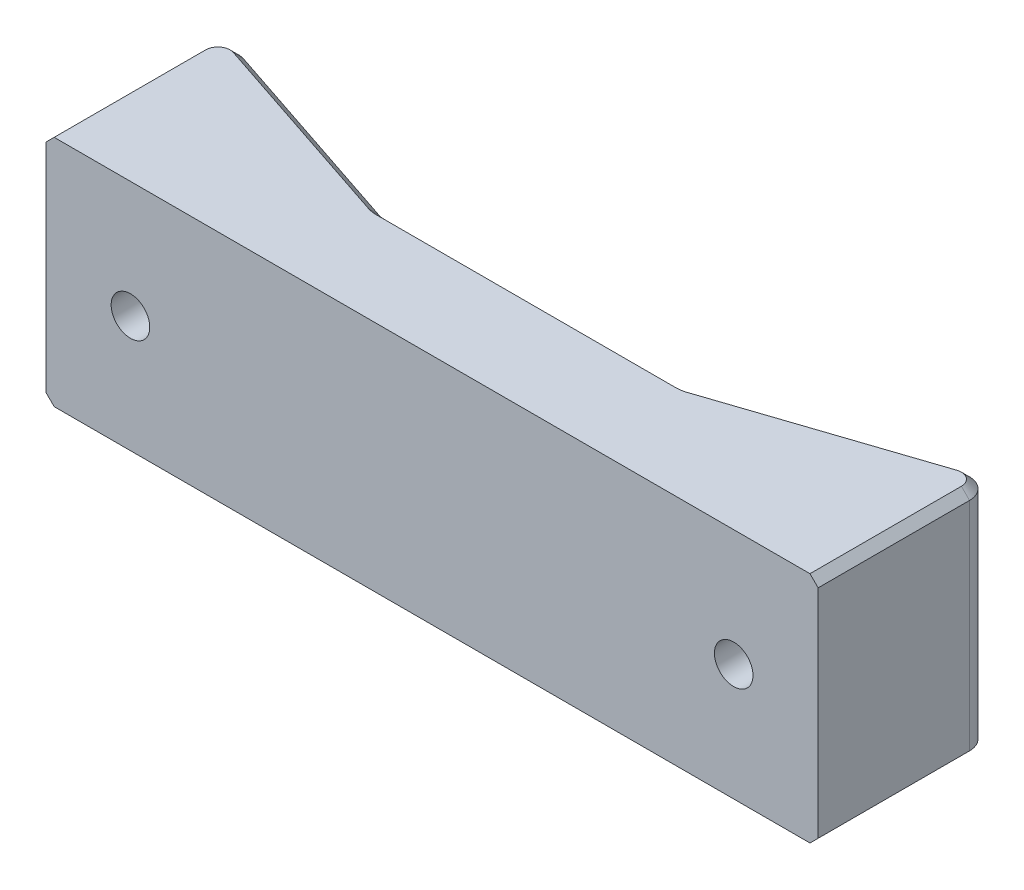
ISO-10303-21;
HEADER;
FILE_DESCRIPTION(('STEP AP214'),'2;1');
FILE_NAME('part.step','',(''),(''),'','','');
FILE_SCHEMA(('AUTOMOTIVE_DESIGN { 1 0 10303 214 1 1 1 1 }'));
ENDSEC;
DATA;
#1=APPLICATION_CONTEXT('core data for automotive mechanical design processes');
#2=APPLICATION_PROTOCOL_DEFINITION('international standard','automotive_design',2000,#1);
#3=PRODUCT_CONTEXT('',#1,'mechanical');
#4=PRODUCT('Part','Part','',(#3));
#5=PRODUCT_RELATED_PRODUCT_CATEGORY('part','',(#4));
#6=PRODUCT_DEFINITION_FORMATION('','',#4);
#7=PRODUCT_DEFINITION_CONTEXT('part definition',#1,'design');
#8=PRODUCT_DEFINITION('design','',#6,#7);
#9=PRODUCT_DEFINITION_SHAPE('','',#8);
#10=(LENGTH_UNIT() NAMED_UNIT(*) SI_UNIT(.MILLI.,.METRE.));
#11=(NAMED_UNIT(*) PLANE_ANGLE_UNIT() SI_UNIT($,.RADIAN.));
#12=(NAMED_UNIT(*) SI_UNIT($,.STERADIAN.) SOLID_ANGLE_UNIT());
#13=UNCERTAINTY_MEASURE_WITH_UNIT(LENGTH_MEASURE(1.E-05),#10,'distance_accuracy_value','');
#14=(GEOMETRIC_REPRESENTATION_CONTEXT(3) GLOBAL_UNCERTAINTY_ASSIGNED_CONTEXT((#13)) GLOBAL_UNIT_ASSIGNED_CONTEXT((#10,
#11,#12)) REPRESENTATION_CONTEXT('',''));
#15=CARTESIAN_POINT('',(0.,0.,0.));
#16=DIRECTION('',(0.,0.,1.));
#17=DIRECTION('',(1.,0.,0.));
#18=AXIS2_PLACEMENT_3D('',#15,#16,#17);
#19=CARTESIAN_POINT('',(48.,14.5,0.));
#20=DIRECTION('',(-1.,0.,0.));
#21=DIRECTION('',(0.,0.,1.));
#22=AXIS2_PLACEMENT_3D('',#19,#20,#21);
#23=PLANE('',#22);
#24=DIRECTION('',(0.,-1.,0.));
#25=VECTOR('',#24,1.);
#26=CARTESIAN_POINT('',(48.,14.5,0.));
#27=LINE('',#26,#25);
#28=CARTESIAN_POINT('',(48.,13.484,0.));
#29=VERTEX_POINT('',#28);
#30=CARTESIAN_POINT('',(48.,-13.484,0.));
#31=VERTEX_POINT('',#30);
#32=EDGE_CURVE('E205',#29,#31,#27,.T.);
#33=ORIENTED_EDGE('',*,*,#32,.T.);
#34=DIRECTION('',(0.,0.,-1.));
#35=VECTOR('',#34,1.);
#36=CARTESIAN_POINT('',(48.,-13.484,0.));
#37=LINE('',#36,#35);
#38=CARTESIAN_POINT('',(48.,-13.484,-18.8259382477241));
#39=VERTEX_POINT('',#38);
#40=EDGE_CURVE('E183',#31,#39,#37,.T.);
#41=ORIENTED_EDGE('',*,*,#40,.T.);
#42=DIRECTION('',(0.,-1.,0.));
#43=VECTOR('',#42,1.);
#44=CARTESIAN_POINT('',(48.,14.5,-18.8259382477241));
#45=LINE('',#44,#43);
#46=CARTESIAN_POINT('',(48.,13.484,-18.8259382477241));
#47=VERTEX_POINT('',#46);
#48=EDGE_CURVE('E203',#39,#47,#45,.F.);
#49=ORIENTED_EDGE('',*,*,#48,.T.);
#50=DIRECTION('',(0.,0.,1.));
#51=VECTOR('',#50,1.);
#52=CARTESIAN_POINT('',(48.,13.484,0.));
#53=LINE('',#52,#51);
#54=EDGE_CURVE('E207',#47,#29,#53,.T.);
#55=ORIENTED_EDGE('',*,*,#54,.T.);
#56=EDGE_LOOP('',(#33,#41,#49,#55));
#57=FACE_BOUND('',#56,.T.);
#58=ADVANCED_FACE('F35',(#57),#23,.F.);
#59=CARTESIAN_POINT('',(48.,14.5,-22.35));
#60=DIRECTION('',(0.316227766016838,0.,0.948683298050514));
#61=DIRECTION('',(0.948683298050514,0.,-0.316227766016838));
#62=AXIS2_PLACEMENT_3D('',#59,#60,#61);
#63=PLANE('',#62);
#64=CARTESIAN_POINT('',(37.5,0.,-18.85));
#65=DIRECTION('',(0.316227766016838,0.,0.948683298050514));
#66=DIRECTION('',(0.948683298050514,0.,-0.316227766016838));
#67=AXIS2_PLACEMENT_3D('',#64,#65,#66);
#68=ELLIPSE('',#67,4.95423500093046,4.7);
#69=CARTESIAN_POINT('',(42.2,0.,-20.4166666666667));
#70=VERTEX_POINT('',#69);
#71=EDGE_CURVE('E348',#70,#70,#68,.T.);
#72=ORIENTED_EDGE('',*,*,#71,.T.);
#73=EDGE_LOOP('',(#72));
#74=FACE_BOUND('',#73,.T.);
#75=DIRECTION('',(0.,-1.,0.));
#76=VECTOR('',#75,1.);
#77=CARTESIAN_POINT('',(44.6567814743172,14.5,-21.2355938247724));
#78=LINE('',#77,#76);
#79=CARTESIAN_POINT('',(44.6567814743172,13.484,-21.2355938247724));
#80=VERTEX_POINT('',#79);
#81=CARTESIAN_POINT('',(44.6567814743172,-13.484,-21.2355938247724));
#82=VERTEX_POINT('',#81);
#83=EDGE_CURVE('E215',#80,#82,#78,.T.);
#84=ORIENTED_EDGE('',*,*,#83,.T.);
#85=DIRECTION('',(-0.948683298050514,0.,0.316227766016838));
#86=VECTOR('',#85,1.);
#87=CARTESIAN_POINT('',(48.,-13.484,-22.35));
#88=LINE('',#87,#86);
#89=CARTESIAN_POINT('',(19.4410332688551,-13.484,-12.8303444229517));
#90=VERTEX_POINT('',#89);
#91=EDGE_CURVE('E253',#82,#90,#88,.T.);
#92=ORIENTED_EDGE('',*,*,#91,.T.);
#93=DIRECTION('',(0.,-1.,0.));
#94=VECTOR('',#93,1.);
#95=CARTESIAN_POINT('',(19.4410332688551,14.5,-12.8303444229517));
#96=LINE('',#95,#94);
#97=CARTESIAN_POINT('',(19.4410332688551,13.484,-12.8303444229517));
#98=VERTEX_POINT('',#97);
#99=EDGE_CURVE('E211',#90,#98,#96,.F.);
#100=ORIENTED_EDGE('',*,*,#99,.T.);
#101=DIRECTION('',(0.948683298050514,0.,-0.316227766016838));
#102=VECTOR('',#101,1.);
#103=CARTESIAN_POINT('',(44.6567814743172,13.484,-21.2355938247724));
#104=LINE('',#103,#102);
#105=EDGE_CURVE('E251',#98,#80,#104,.T.);
#106=ORIENTED_EDGE('',*,*,#105,.T.);
#107=EDGE_LOOP('',(#84,#92,#100,#106));
#108=FACE_BOUND('',#107,.T.);
#109=ADVANCED_FACE('F378',(#74,#108),#63,.F.);
#110=CARTESIAN_POINT('',(19.05,14.5,-12.7));
#111=DIRECTION('',(0.,0.,1.));
#112=DIRECTION('',(1.,0.,0.));
#113=AXIS2_PLACEMENT_3D('',#110,#111,#112);
#114=PLANE('',#113);
#115=DIRECTION('',(0.,-1.,0.));
#116=VECTOR('',#115,1.);
#117=CARTESIAN_POINT('',(18.6378147431723,-14.5,-12.7));
#118=LINE('',#117,#116);
#119=CARTESIAN_POINT('',(18.6378147431723,13.484,-12.7));
#120=VERTEX_POINT('',#119);
#121=CARTESIAN_POINT('',(18.6378147431723,-13.484,-12.7));
#122=VERTEX_POINT('',#121);
#123=EDGE_CURVE('E371',#120,#122,#118,.T.);
#124=ORIENTED_EDGE('',*,*,#123,.T.);
#125=DIRECTION('',(-1.,0.,0.));
#126=VECTOR('',#125,1.);
#127=CARTESIAN_POINT('',(19.05,-13.484,-12.7));
#128=LINE('',#127,#126);
#129=CARTESIAN_POINT('',(-18.6378147431723,-13.484,-12.7));
#130=VERTEX_POINT('',#129);
#131=EDGE_CURVE('E269',#122,#130,#128,.T.);
#132=ORIENTED_EDGE('',*,*,#131,.T.);
#133=DIRECTION('',(0.,-1.,0.));
#134=VECTOR('',#133,1.);
#135=CARTESIAN_POINT('',(-18.6378147431723,14.5,-12.7));
#136=LINE('',#135,#134);
#137=CARTESIAN_POINT('',(-18.6378147431723,13.484,-12.7));
#138=VERTEX_POINT('',#137);
#139=EDGE_CURVE('E374',#130,#138,#136,.F.);
#140=ORIENTED_EDGE('',*,*,#139,.T.);
#141=DIRECTION('',(1.,0.,0.));
#142=VECTOR('',#141,1.);
#143=CARTESIAN_POINT('',(18.6378147431723,13.484,-12.7));
#144=LINE('',#143,#142);
#145=EDGE_CURVE('E267',#138,#120,#144,.T.);
#146=ORIENTED_EDGE('',*,*,#145,.T.);
#147=EDGE_LOOP('',(#124,#132,#140,#146));
#148=FACE_BOUND('',#147,.T.);
#149=ADVANCED_FACE('F397',(#148),#114,.F.);
#150=CARTESIAN_POINT('',(-48.,14.5,-22.35));
#151=DIRECTION('',(-0.316227766016838,0.,0.948683298050514));
#152=DIRECTION('',(0.948683298050514,0.,0.316227766016838));
#153=AXIS2_PLACEMENT_3D('',#150,#151,#152);
#154=PLANE('',#153);
#155=CARTESIAN_POINT('',(-37.5,0.,-18.85));
#156=DIRECTION('',(-0.316227766016838,0.,0.948683298050514));
#157=DIRECTION('',(-0.948683298050514,0.,-0.316227766016838));
#158=AXIS2_PLACEMENT_3D('',#155,#156,#157);
#159=ELLIPSE('',#158,4.95423500093046,4.7);
#160=CARTESIAN_POINT('',(-42.2,0.,-20.4166666666667));
#161=VERTEX_POINT('',#160);
#162=EDGE_CURVE('E358',#161,#161,#159,.T.);
#163=ORIENTED_EDGE('',*,*,#162,.T.);
#164=EDGE_LOOP('',(#163));
#165=FACE_BOUND('',#164,.T.);
#166=DIRECTION('',(0.,-1.,0.));
#167=VECTOR('',#166,1.);
#168=CARTESIAN_POINT('',(-19.4410332688551,-14.5,-12.8303444229517));
#169=LINE('',#168,#167);
#170=CARTESIAN_POINT('',(-19.4410332688551,13.484,-12.8303444229517));
#171=VERTEX_POINT('',#170);
#172=CARTESIAN_POINT('',(-19.4410332688551,-13.484,-12.8303444229517));
#173=VERTEX_POINT('',#172);
#174=EDGE_CURVE('E365',#171,#173,#169,.T.);
#175=ORIENTED_EDGE('',*,*,#174,.T.);
#176=DIRECTION('',(-0.948683298050514,0.,-0.316227766016838));
#177=VECTOR('',#176,1.);
#178=CARTESIAN_POINT('',(-48.,-13.484,-22.35));
#179=LINE('',#178,#177);
#180=CARTESIAN_POINT('',(-44.6567814743172,-13.484,-21.2355938247724));
#181=VERTEX_POINT('',#180);
#182=EDGE_CURVE('E257',#173,#181,#179,.T.);
#183=ORIENTED_EDGE('',*,*,#182,.T.);
#184=DIRECTION('',(0.,-1.,0.));
#185=VECTOR('',#184,1.);
#186=CARTESIAN_POINT('',(-44.6567814743172,14.5,-21.2355938247724));
#187=LINE('',#186,#185);
#188=CARTESIAN_POINT('',(-44.6567814743172,13.484,-21.2355938247724));
#189=VERTEX_POINT('',#188);
#190=EDGE_CURVE('E368',#181,#189,#187,.F.);
#191=ORIENTED_EDGE('',*,*,#190,.T.);
#192=DIRECTION('',(0.948683298050514,0.,0.316227766016838));
#193=VECTOR('',#192,1.);
#194=CARTESIAN_POINT('',(-19.4410332688551,13.484,-12.8303444229517));
#195=LINE('',#194,#193);
#196=EDGE_CURVE('E255',#189,#171,#195,.T.);
#197=ORIENTED_EDGE('',*,*,#196,.T.);
#198=EDGE_LOOP('',(#175,#183,#191,#197));
#199=FACE_BOUND('',#198,.T.);
#200=ADVANCED_FACE('F415',(#165,#199),#154,.F.);
#201=CARTESIAN_POINT('',(-48.,14.5,0.));
#202=DIRECTION('',(1.,0.,0.));
#203=DIRECTION('',(0.,0.,-1.));
#204=AXIS2_PLACEMENT_3D('',#201,#202,#203);
#205=PLANE('',#204);
#206=DIRECTION('',(0.,-1.,0.));
#207=VECTOR('',#206,1.);
#208=CARTESIAN_POINT('',(-48.,14.5,-18.8259382477241));
#209=LINE('',#208,#207);
#210=CARTESIAN_POINT('',(-48.,13.484,-18.8259382477241));
#211=VERTEX_POINT('',#210);
#212=CARTESIAN_POINT('',(-48.,-13.484,-18.8259382477241));
#213=VERTEX_POINT('',#212);
#214=EDGE_CURVE('E355',#211,#213,#209,.T.);
#215=ORIENTED_EDGE('',*,*,#214,.T.);
#216=DIRECTION('',(0.,0.,1.));
#217=VECTOR('',#216,1.);
#218=CARTESIAN_POINT('',(-48.,-13.484,0.));
#219=LINE('',#218,#217);
#220=CARTESIAN_POINT('',(-48.,-13.484,0.));
#221=VERTEX_POINT('',#220);
#222=EDGE_CURVE('E245',#213,#221,#219,.T.);
#223=ORIENTED_EDGE('',*,*,#222,.T.);
#224=DIRECTION('',(0.,-1.,0.));
#225=VECTOR('',#224,1.);
#226=CARTESIAN_POINT('',(-48.,14.5,0.));
#227=LINE('',#226,#225);
#228=CARTESIAN_POINT('',(-48.,13.484,0.));
#229=VERTEX_POINT('',#228);
#230=EDGE_CURVE('E346',#229,#221,#227,.T.);
#231=ORIENTED_EDGE('',*,*,#230,.F.);
#232=DIRECTION('',(0.,0.,-1.));
#233=VECTOR('',#232,1.);
#234=CARTESIAN_POINT('',(-48.,13.484,-18.8259382477241));
#235=LINE('',#234,#233);
#236=EDGE_CURVE('E243',#229,#211,#235,.T.);
#237=ORIENTED_EDGE('',*,*,#236,.T.);
#238=EDGE_LOOP('',(#215,#223,#231,#237));
#239=FACE_BOUND('',#238,.T.);
#240=ADVANCED_FACE('F431',(#239),#205,.F.);
#241=CARTESIAN_POINT('',(-48.,14.5,0.));
#242=DIRECTION('',(0.,0.,-1.));
#243=DIRECTION('',(-1.,0.,0.));
#244=AXIS2_PLACEMENT_3D('',#241,#242,#243);
#245=PLANE('',#244);
#246=CARTESIAN_POINT('',(-37.5,0.,0.));
#247=DIRECTION('',(0.,0.,-1.));
#248=DIRECTION('',(-1.,0.,0.));
#249=AXIS2_PLACEMENT_3D('',#246,#247,#248);
#250=CIRCLE('',#249,2.40000000000001);
#251=CARTESIAN_POINT('',(-39.9,0.,0.));
#252=VERTEX_POINT('',#251);
#253=EDGE_CURVE('E362',#252,#252,#250,.T.);
#254=ORIENTED_EDGE('',*,*,#253,.T.);
#255=EDGE_LOOP('',(#254));
#256=FACE_BOUND('',#255,.T.);
#257=CARTESIAN_POINT('',(37.5,0.,0.));
#258=DIRECTION('',(0.,0.,-1.));
#259=DIRECTION('',(-1.,0.,0.));
#260=AXIS2_PLACEMENT_3D('',#257,#258,#259);
#261=CIRCLE('',#260,2.40000000000001);
#262=CARTESIAN_POINT('',(35.1,0.,0.));
#263=VERTEX_POINT('',#262);
#264=EDGE_CURVE('E351',#263,#263,#261,.T.);
#265=ORIENTED_EDGE('',*,*,#264,.T.);
#266=EDGE_LOOP('',(#265));
#267=FACE_BOUND('',#266,.T.);
#268=DIRECTION('',(1.,0.,0.));
#269=VECTOR('',#268,1.);
#270=CARTESIAN_POINT('',(-48.,-14.5,0.));
#271=LINE('',#270,#269);
#272=CARTESIAN_POINT('',(-46.984,-14.5,0.));
#273=VERTEX_POINT('',#272);
#274=CARTESIAN_POINT('',(46.984,-14.5,0.));
#275=VERTEX_POINT('',#274);
#276=EDGE_CURVE('E344',#273,#275,#271,.T.);
#277=ORIENTED_EDGE('',*,*,#276,.T.);
#278=DIRECTION('',(-0.707106781186552,-0.707106781186543,0.));
#279=VECTOR('',#278,1.);
#280=CARTESIAN_POINT('',(48.,-13.484,0.));
#281=LINE('',#280,#279);
#282=EDGE_CURVE('E241',#275,#31,#281,.F.);
#283=ORIENTED_EDGE('',*,*,#282,.T.);
#284=ORIENTED_EDGE('',*,*,#32,.F.);
#285=DIRECTION('',(-0.707106781186543,0.707106781186552,0.));
#286=VECTOR('',#285,1.);
#287=CARTESIAN_POINT('',(46.984,14.5,0.));
#288=LINE('',#287,#286);
#289=CARTESIAN_POINT('',(46.984,14.5,0.));
#290=VERTEX_POINT('',#289);
#291=EDGE_CURVE('E237',#29,#290,#288,.T.);
#292=ORIENTED_EDGE('',*,*,#291,.T.);
#293=DIRECTION('',(1.,0.,0.));
#294=VECTOR('',#293,1.);
#295=CARTESIAN_POINT('',(-48.,14.5,0.));
#296=LINE('',#295,#294);
#297=CARTESIAN_POINT('',(-46.984,14.5,0.));
#298=VERTEX_POINT('',#297);
#299=EDGE_CURVE('E337',#298,#290,#296,.T.);
#300=ORIENTED_EDGE('',*,*,#299,.F.);
#301=DIRECTION('',(-0.707106781186543,-0.707106781186552,0.));
#302=VECTOR('',#301,1.);
#303=CARTESIAN_POINT('',(-46.984,14.5,0.));
#304=LINE('',#303,#302);
#305=EDGE_CURVE('E235',#298,#229,#304,.T.);
#306=ORIENTED_EDGE('',*,*,#305,.T.);
#307=ORIENTED_EDGE('',*,*,#230,.T.);
#308=DIRECTION('',(-0.707106781186552,0.707106781186543,0.));
#309=VECTOR('',#308,1.);
#310=CARTESIAN_POINT('',(-48.,-13.484,0.));
#311=LINE('',#310,#309);
#312=EDGE_CURVE('E239',#221,#273,#311,.F.);
#313=ORIENTED_EDGE('',*,*,#312,.T.);
#314=EDGE_LOOP('',(#277,#283,#284,#292,#300,#306,#307,#313));
#315=FACE_BOUND('',#314,.T.);
#316=ADVANCED_FACE('F340',(#256,#267,#315),#245,.F.);
#317=CARTESIAN_POINT('',(0.,14.5,0.));
#318=DIRECTION('',(0.,1.,0.));
#319=DIRECTION('',(0.,0.,1.));
#320=AXIS2_PLACEMENT_3D('',#317,#318,#319);
#321=PLANE('',#320);
#322=ORIENTED_EDGE('',*,*,#299,.T.);
#323=DIRECTION('',(0.,0.,-1.));
#324=VECTOR('',#323,1.);
#325=CARTESIAN_POINT('',(46.984,14.5,-18.8259382477241));
#326=LINE('',#325,#324);
#327=CARTESIAN_POINT('',(46.984,14.5,-18.8259382477241));
#328=VERTEX_POINT('',#327);
#329=EDGE_CURVE('E11',#290,#328,#326,.T.);
#330=ORIENTED_EDGE('',*,*,#329,.T.);
#331=CARTESIAN_POINT('',(45.46,14.5,-18.8259382477241));
#332=DIRECTION('',(0.,1.,0.));
#333=DIRECTION('',(0.,0.,1.));
#334=AXIS2_PLACEMENT_3D('',#331,#332,#333);
#335=CIRCLE('',#334,1.52400000000001);
#336=CARTESIAN_POINT('',(44.9780688845903,14.5,-20.2717315939531));
#337=VERTEX_POINT('',#336);
#338=EDGE_CURVE('E282',#328,#337,#335,.T.);
#339=ORIENTED_EDGE('',*,*,#338,.T.);
#340=DIRECTION('',(-0.948683298050514,0.,0.316227766016838));
#341=VECTOR('',#340,1.);
#342=CARTESIAN_POINT('',(19.7623206791282,14.5,-11.8664821921324));
#343=LINE('',#342,#341);
#344=CARTESIAN_POINT('',(19.7623206791282,14.5,-11.8664821921324));
#345=VERTEX_POINT('',#344);
#346=EDGE_CURVE('E279',#337,#345,#343,.T.);
#347=ORIENTED_EDGE('',*,*,#346,.T.);
#348=CARTESIAN_POINT('',(18.6378147431723,14.5,-15.24));
#349=DIRECTION('',(0.,1.,0.));
#350=DIRECTION('',(0.,0.,1.));
#351=AXIS2_PLACEMENT_3D('',#348,#349,#350);
#352=CIRCLE('',#351,3.55599999999999);
#353=CARTESIAN_POINT('',(18.6378147431723,14.5,-11.684));
#354=VERTEX_POINT('',#353);
#355=EDGE_CURVE('E275',#345,#354,#352,.F.);
#356=ORIENTED_EDGE('',*,*,#355,.T.);
#357=DIRECTION('',(-1.,0.,0.));
#358=VECTOR('',#357,1.);
#359=CARTESIAN_POINT('',(-18.6378147431723,14.5,-11.684));
#360=LINE('',#359,#358);
#361=CARTESIAN_POINT('',(-18.6378147431723,14.5,-11.684));
#362=VERTEX_POINT('',#361);
#363=EDGE_CURVE('E271',#354,#362,#360,.T.);
#364=ORIENTED_EDGE('',*,*,#363,.T.);
#365=CARTESIAN_POINT('',(-18.6378147431723,14.5,-15.24));
#366=DIRECTION('',(0.,1.,0.));
#367=DIRECTION('',(0.,0.,1.));
#368=AXIS2_PLACEMENT_3D('',#365,#366,#367);
#369=CIRCLE('',#368,3.55599999999999);
#370=CARTESIAN_POINT('',(-19.7623206791282,14.5,-11.8664821921324));
#371=VERTEX_POINT('',#370);
#372=EDGE_CURVE('E273',#362,#371,#369,.F.);
#373=ORIENTED_EDGE('',*,*,#372,.T.);
#374=DIRECTION('',(-0.948683298050514,0.,-0.316227766016838));
#375=VECTOR('',#374,1.);
#376=CARTESIAN_POINT('',(-44.9780688845903,14.5,-20.2717315939531));
#377=LINE('',#376,#375);
#378=CARTESIAN_POINT('',(-44.9780688845903,14.5,-20.2717315939531));
#379=VERTEX_POINT('',#378);
#380=EDGE_CURVE('E277',#371,#379,#377,.T.);
#381=ORIENTED_EDGE('',*,*,#380,.T.);
#382=CARTESIAN_POINT('',(-45.46,14.5,-18.8259382477241));
#383=DIRECTION('',(0.,1.,0.));
#384=DIRECTION('',(0.,0.,1.));
#385=AXIS2_PLACEMENT_3D('',#382,#383,#384);
#386=CIRCLE('',#385,1.52400000000001);
#387=CARTESIAN_POINT('',(-46.984,14.5,-18.8259382477241));
#388=VERTEX_POINT('',#387);
#389=EDGE_CURVE('E61',#379,#388,#386,.T.);
#390=ORIENTED_EDGE('',*,*,#389,.T.);
#391=DIRECTION('',(0.,0.,1.));
#392=VECTOR('',#391,1.);
#393=CARTESIAN_POINT('',(-46.984,14.5,0.));
#394=LINE('',#393,#392);
#395=EDGE_CURVE('E45',#388,#298,#394,.T.);
#396=ORIENTED_EDGE('',*,*,#395,.T.);
#397=EDGE_LOOP('',(#322,#330,#339,#347,#356,#364,#373,#381,#390,#396));
#398=FACE_BOUND('',#397,.T.);
#399=ADVANCED_FACE('F336',(#398),#321,.T.);
#400=CARTESIAN_POINT('',(0.,-14.5,0.));
#401=DIRECTION('',(0.,1.,0.));
#402=DIRECTION('',(0.,0.,1.));
#403=AXIS2_PLACEMENT_3D('',#400,#401,#402);
#404=PLANE('',#403);
#405=CARTESIAN_POINT('',(45.46,-14.5,-18.8259382477241));
#406=DIRECTION('',(0.,1.,0.));
#407=DIRECTION('',(0.,0.,1.));
#408=AXIS2_PLACEMENT_3D('',#405,#406,#407);
#409=CIRCLE('',#408,1.524);
#410=CARTESIAN_POINT('',(44.9780688845903,-14.5,-20.2717315939531));
#411=VERTEX_POINT('',#410);
#412=CARTESIAN_POINT('',(46.984,-14.5,-18.8259382477241));
#413=VERTEX_POINT('',#412);
#414=EDGE_CURVE('E230',#411,#413,#409,.F.);
#415=ORIENTED_EDGE('',*,*,#414,.T.);
#416=DIRECTION('',(0.,0.,1.));
#417=VECTOR('',#416,1.);
#418=CARTESIAN_POINT('',(46.984,-14.5,0.));
#419=LINE('',#418,#417);
#420=EDGE_CURVE('E184',#413,#275,#419,.T.);
#421=ORIENTED_EDGE('',*,*,#420,.T.);
#422=ORIENTED_EDGE('',*,*,#276,.F.);
#423=DIRECTION('',(0.,0.,-1.));
#424=VECTOR('',#423,1.);
#425=CARTESIAN_POINT('',(-46.984,-14.5,0.));
#426=LINE('',#425,#424);
#427=CARTESIAN_POINT('',(-46.984,-14.5,-18.8259382477241));
#428=VERTEX_POINT('',#427);
#429=EDGE_CURVE('E232',#273,#428,#426,.T.);
#430=ORIENTED_EDGE('',*,*,#429,.T.);
#431=CARTESIAN_POINT('',(-45.46,-14.5,-18.8259382477241));
#432=DIRECTION('',(0.,1.,0.));
#433=DIRECTION('',(0.,0.,1.));
#434=AXIS2_PLACEMENT_3D('',#431,#432,#433);
#435=CIRCLE('',#434,1.524);
#436=CARTESIAN_POINT('',(-44.9780688845903,-14.5,-20.2717315939531));
#437=VERTEX_POINT('',#436);
#438=EDGE_CURVE('E228',#428,#437,#435,.F.);
#439=ORIENTED_EDGE('',*,*,#438,.T.);
#440=DIRECTION('',(0.948683298050514,0.,0.316227766016838));
#441=VECTOR('',#440,1.);
#442=CARTESIAN_POINT('',(1.58371258972689,-14.5,-4.75113776918066));
#443=LINE('',#442,#441);
#444=CARTESIAN_POINT('',(-19.7623206791282,-14.5,-11.8664821921324));
#445=VERTEX_POINT('',#444);
#446=EDGE_CURVE('E224',#437,#445,#443,.T.);
#447=ORIENTED_EDGE('',*,*,#446,.T.);
#448=CARTESIAN_POINT('',(-18.6378147431723,-14.5,-15.24));
#449=DIRECTION('',(0.,1.,0.));
#450=DIRECTION('',(0.,0.,1.));
#451=AXIS2_PLACEMENT_3D('',#448,#449,#450);
#452=CIRCLE('',#451,3.556);
#453=CARTESIAN_POINT('',(-18.6378147431723,-14.5,-11.684));
#454=VERTEX_POINT('',#453);
#455=EDGE_CURVE('E220',#445,#454,#452,.T.);
#456=ORIENTED_EDGE('',*,*,#455,.T.);
#457=DIRECTION('',(1.,0.,0.));
#458=VECTOR('',#457,1.);
#459=CARTESIAN_POINT('',(0.,-14.5,-11.684));
#460=LINE('',#459,#458);
#461=CARTESIAN_POINT('',(18.6378147431723,-14.5,-11.684));
#462=VERTEX_POINT('',#461);
#463=EDGE_CURVE('E206',#454,#462,#460,.T.);
#464=ORIENTED_EDGE('',*,*,#463,.T.);
#465=CARTESIAN_POINT('',(18.6378147431723,-14.5,-15.24));
#466=DIRECTION('',(0.,1.,0.));
#467=DIRECTION('',(0.,0.,1.));
#468=AXIS2_PLACEMENT_3D('',#465,#466,#467);
#469=CIRCLE('',#468,3.556);
#470=CARTESIAN_POINT('',(19.7623206791282,-14.5,-11.8664821921324));
#471=VERTEX_POINT('',#470);
#472=EDGE_CURVE('E222',#462,#471,#469,.T.);
#473=ORIENTED_EDGE('',*,*,#472,.T.);
#474=DIRECTION('',(0.948683298050514,0.,-0.316227766016838));
#475=VECTOR('',#474,1.);
#476=CARTESIAN_POINT('',(-1.58371258972689,-14.5,-4.75113776918066));
#477=LINE('',#476,#475);
#478=EDGE_CURVE('E226',#471,#411,#477,.T.);
#479=ORIENTED_EDGE('',*,*,#478,.T.);
#480=EDGE_LOOP('',(#415,#421,#422,#430,#439,#447,#456,#464,#473,#479));
#481=FACE_BOUND('',#480,.T.);
#482=ADVANCED_FACE('F438',(#481),#404,.F.);
#483=CARTESIAN_POINT('',(37.5,0.,-25.4));
#484=DIRECTION('',(0.,0.,-1.));
#485=DIRECTION('',(-1.,0.,0.));
#486=AXIS2_PLACEMENT_3D('',#483,#484,#485);
#487=CYLINDRICAL_SURFACE('',#486,4.7);
#488=CARTESIAN_POINT('',(37.5,0.,-12.7));
#489=DIRECTION('',(0.,0.,-1.));
#490=DIRECTION('',(-1.,0.,0.));
#491=AXIS2_PLACEMENT_3D('',#488,#489,#490);
#492=CIRCLE('',#491,4.7);
#493=CARTESIAN_POINT('',(32.8,0.,-12.7));
#494=VERTEX_POINT('',#493);
#495=EDGE_CURVE('E361',#494,#494,#492,.T.);
#496=ORIENTED_EDGE('',*,*,#495,.F.);
#497=EDGE_LOOP('',(#496));
#498=FACE_BOUND('',#497,.T.);
#499=ORIENTED_EDGE('',*,*,#71,.F.);
#500=EDGE_LOOP('',(#499));
#501=FACE_BOUND('',#500,.T.);
#502=ADVANCED_FACE('F440',(#498,#501),#487,.F.);
#503=CARTESIAN_POINT('',(37.5,0.,-25.4));
#504=DIRECTION('',(0.,0.,-1.));
#505=DIRECTION('',(-1.,0.,0.));
#506=AXIS2_PLACEMENT_3D('',#503,#504,#505);
#507=CYLINDRICAL_SURFACE('',#506,2.4);
#508=ORIENTED_EDGE('',*,*,#264,.F.);
#509=EDGE_LOOP('',(#508));
#510=FACE_BOUND('',#509,.T.);
#511=CARTESIAN_POINT('',(37.5,0.,-10.4));
#512=DIRECTION('',(0.,0.,-1.));
#513=DIRECTION('',(-1.,0.,0.));
#514=AXIS2_PLACEMENT_3D('',#511,#512,#513);
#515=CIRCLE('',#514,2.4);
#516=CARTESIAN_POINT('',(35.1,0.,-10.4));
#517=VERTEX_POINT('',#516);
#518=EDGE_CURVE('E810',#517,#517,#515,.T.);
#519=ORIENTED_EDGE('',*,*,#518,.T.);
#520=EDGE_LOOP('',(#519));
#521=FACE_BOUND('',#520,.T.);
#522=ADVANCED_FACE('F446',(#510,#521),#507,.F.);
#523=CARTESIAN_POINT('',(37.5,0.,-12.7));
#524=DIRECTION('',(0.,0.,-1.));
#525=DIRECTION('',(-1.,0.,0.));
#526=AXIS2_PLACEMENT_3D('',#523,#524,#525);
#527=CONICAL_SURFACE('',#526,4.7,0.785398163397449);
#528=ORIENTED_EDGE('',*,*,#518,.F.);
#529=EDGE_LOOP('',(#528));
#530=FACE_BOUND('',#529,.T.);
#531=ORIENTED_EDGE('',*,*,#495,.T.);
#532=EDGE_LOOP('',(#531));
#533=FACE_BOUND('',#532,.T.);
#534=ADVANCED_FACE('F643',(#530,#533),#527,.F.);
#535=CARTESIAN_POINT('',(-37.5,0.,-25.4));
#536=DIRECTION('',(0.,0.,-1.));
#537=DIRECTION('',(-1.,0.,0.));
#538=AXIS2_PLACEMENT_3D('',#535,#536,#537);
#539=CYLINDRICAL_SURFACE('',#538,4.7);
#540=CARTESIAN_POINT('',(-37.5,0.,-12.7));
#541=DIRECTION('',(0.,0.,-1.));
#542=DIRECTION('',(-1.,0.,0.));
#543=AXIS2_PLACEMENT_3D('',#540,#541,#542);
#544=CIRCLE('',#543,4.7);
#545=CARTESIAN_POINT('',(-42.2,0.,-12.7));
#546=VERTEX_POINT('',#545);
#547=EDGE_CURVE('E304',#546,#546,#544,.T.);
#548=ORIENTED_EDGE('',*,*,#547,.F.);
#549=EDGE_LOOP('',(#548));
#550=FACE_BOUND('',#549,.T.);
#551=ORIENTED_EDGE('',*,*,#162,.F.);
#552=EDGE_LOOP('',(#551));
#553=FACE_BOUND('',#552,.T.);
#554=ADVANCED_FACE('F635',(#550,#553),#539,.F.);
#555=CARTESIAN_POINT('',(-37.5,0.,-25.4));
#556=DIRECTION('',(0.,0.,-1.));
#557=DIRECTION('',(-1.,0.,0.));
#558=AXIS2_PLACEMENT_3D('',#555,#556,#557);
#559=CYLINDRICAL_SURFACE('',#558,2.4);
#560=ORIENTED_EDGE('',*,*,#253,.F.);
#561=EDGE_LOOP('',(#560));
#562=FACE_BOUND('',#561,.T.);
#563=CARTESIAN_POINT('',(-37.5,0.,-10.4));
#564=DIRECTION('',(0.,0.,-1.));
#565=DIRECTION('',(-1.,0.,0.));
#566=AXIS2_PLACEMENT_3D('',#563,#564,#565);
#567=CIRCLE('',#566,2.4);
#568=CARTESIAN_POINT('',(-39.9,0.,-10.4));
#569=VERTEX_POINT('',#568);
#570=EDGE_CURVE('E818',#569,#569,#567,.T.);
#571=ORIENTED_EDGE('',*,*,#570,.T.);
#572=EDGE_LOOP('',(#571));
#573=FACE_BOUND('',#572,.T.);
#574=ADVANCED_FACE('F627',(#562,#573),#559,.F.);
#575=CARTESIAN_POINT('',(-37.5,0.,-12.7));
#576=DIRECTION('',(0.,0.,-1.));
#577=DIRECTION('',(-1.,0.,0.));
#578=AXIS2_PLACEMENT_3D('',#575,#576,#577);
#579=CONICAL_SURFACE('',#578,4.7,0.785398163397449);
#580=ORIENTED_EDGE('',*,*,#570,.F.);
#581=EDGE_LOOP('',(#580));
#582=FACE_BOUND('',#581,.T.);
#583=ORIENTED_EDGE('',*,*,#547,.T.);
#584=EDGE_LOOP('',(#583));
#585=FACE_BOUND('',#584,.T.);
#586=ADVANCED_FACE('F462',(#582,#585),#579,.F.);
#587=CARTESIAN_POINT('',(-45.46,14.5,-18.8259382477241));
#588=DIRECTION('',(0.,-1.,0.));
#589=DIRECTION('',(0.,0.,-1.));
#590=AXIS2_PLACEMENT_3D('',#587,#588,#589);
#591=CYLINDRICAL_SURFACE('',#590,2.54);
#592=ORIENTED_EDGE('',*,*,#190,.F.);
#593=CARTESIAN_POINT('',(-45.46,-13.484,-18.8259382477241));
#594=DIRECTION('',(0.,1.,0.));
#595=DIRECTION('',(0.,0.,1.));
#596=AXIS2_PLACEMENT_3D('',#593,#594,#595);
#597=CIRCLE('',#596,2.54);
#598=EDGE_CURVE('E249',#181,#213,#597,.T.);
#599=ORIENTED_EDGE('',*,*,#598,.T.);
#600=ORIENTED_EDGE('',*,*,#214,.F.);
#601=CARTESIAN_POINT('',(-45.46,13.484,-18.8259382477241));
#602=DIRECTION('',(0.,1.,0.));
#603=DIRECTION('',(0.,0.,1.));
#604=AXIS2_PLACEMENT_3D('',#601,#602,#603);
#605=CIRCLE('',#604,2.54);
#606=EDGE_CURVE('E197',#211,#189,#605,.F.);
#607=ORIENTED_EDGE('',*,*,#606,.T.);
#608=EDGE_LOOP('',(#592,#599,#600,#607));
#609=FACE_BOUND('',#608,.T.);
#610=ADVANCED_FACE('F428',(#609),#591,.T.);
#611=CARTESIAN_POINT('',(-18.6378147431723,14.5,-15.24));
#612=DIRECTION('',(0.,1.,0.));
#613=DIRECTION('',(0.,0.,1.));
#614=AXIS2_PLACEMENT_3D('',#611,#612,#613);
#615=CYLINDRICAL_SURFACE('',#614,2.54);
#616=ORIENTED_EDGE('',*,*,#139,.F.);
#617=CARTESIAN_POINT('',(-18.6378147431723,-13.484,-15.24));
#618=DIRECTION('',(0.,1.,0.));
#619=DIRECTION('',(0.,0.,1.));
#620=AXIS2_PLACEMENT_3D('',#617,#618,#619);
#621=CIRCLE('',#620,2.54);
#622=EDGE_CURVE('E265',#130,#173,#621,.F.);
#623=ORIENTED_EDGE('',*,*,#622,.T.);
#624=ORIENTED_EDGE('',*,*,#174,.F.);
#625=CARTESIAN_POINT('',(-18.6378147431723,13.484,-15.24));
#626=DIRECTION('',(0.,1.,0.));
#627=DIRECTION('',(0.,0.,1.));
#628=AXIS2_PLACEMENT_3D('',#625,#626,#627);
#629=CIRCLE('',#628,2.54);
#630=EDGE_CURVE('E263',#171,#138,#629,.T.);
#631=ORIENTED_EDGE('',*,*,#630,.T.);
#632=EDGE_LOOP('',(#616,#623,#624,#631));
#633=FACE_BOUND('',#632,.T.);
#634=ADVANCED_FACE('F411',(#633),#615,.F.);
#635=CARTESIAN_POINT('',(18.6378147431723,14.5,-15.24));
#636=DIRECTION('',(0.,1.,0.));
#637=DIRECTION('',(0.,0.,1.));
#638=AXIS2_PLACEMENT_3D('',#635,#636,#637);
#639=CYLINDRICAL_SURFACE('',#638,2.54);
#640=ORIENTED_EDGE('',*,*,#99,.F.);
#641=CARTESIAN_POINT('',(18.6378147431723,-13.484,-15.24));
#642=DIRECTION('',(0.,1.,0.));
#643=DIRECTION('',(0.,0.,1.));
#644=AXIS2_PLACEMENT_3D('',#641,#642,#643);
#645=CIRCLE('',#644,2.54);
#646=EDGE_CURVE('E261',#90,#122,#645,.F.);
#647=ORIENTED_EDGE('',*,*,#646,.T.);
#648=ORIENTED_EDGE('',*,*,#123,.F.);
#649=CARTESIAN_POINT('',(18.6378147431723,13.484,-15.24));
#650=DIRECTION('',(0.,1.,0.));
#651=DIRECTION('',(0.,0.,1.));
#652=AXIS2_PLACEMENT_3D('',#649,#650,#651);
#653=CIRCLE('',#652,2.54);
#654=EDGE_CURVE('E259',#120,#98,#653,.T.);
#655=ORIENTED_EDGE('',*,*,#654,.T.);
#656=EDGE_LOOP('',(#640,#647,#648,#655));
#657=FACE_BOUND('',#656,.T.);
#658=ADVANCED_FACE('F393',(#657),#639,.F.);
#659=CARTESIAN_POINT('',(45.46,14.5,-18.8259382477241));
#660=DIRECTION('',(0.,-1.,0.));
#661=DIRECTION('',(0.,0.,-1.));
#662=AXIS2_PLACEMENT_3D('',#659,#660,#661);
#663=CYLINDRICAL_SURFACE('',#662,2.54);
#664=ORIENTED_EDGE('',*,*,#48,.F.);
#665=CARTESIAN_POINT('',(45.46,-13.484,-18.8259382477241));
#666=DIRECTION('',(0.,1.,0.));
#667=DIRECTION('',(0.,0.,1.));
#668=AXIS2_PLACEMENT_3D('',#665,#666,#667);
#669=CIRCLE('',#668,2.54);
#670=EDGE_CURVE('E190',#39,#82,#669,.T.);
#671=ORIENTED_EDGE('',*,*,#670,.T.);
#672=ORIENTED_EDGE('',*,*,#83,.F.);
#673=CARTESIAN_POINT('',(45.46,13.484,-18.8259382477241));
#674=DIRECTION('',(0.,1.,0.));
#675=DIRECTION('',(0.,0.,1.));
#676=AXIS2_PLACEMENT_3D('',#673,#674,#675);
#677=CIRCLE('',#676,2.54);
#678=EDGE_CURVE('E198',#80,#47,#677,.F.);
#679=ORIENTED_EDGE('',*,*,#678,.T.);
#680=EDGE_LOOP('',(#664,#671,#672,#679));
#681=FACE_BOUND('',#680,.T.);
#682=ADVANCED_FACE('F209',(#681),#663,.T.);
#683=CARTESIAN_POINT('',(-48.,-13.484,0.));
#684=DIRECTION('',(0.707106781186543,0.707106781186552,0.));
#685=DIRECTION('',(0.,0.,1.));
#686=AXIS2_PLACEMENT_3D('',#683,#684,#685);
#687=PLANE('',#686);
#688=ORIENTED_EDGE('',*,*,#312,.F.);
#689=ORIENTED_EDGE('',*,*,#222,.F.);
#690=DIRECTION('',(-0.707106781186552,0.707106781186543,0.));
#691=VECTOR('',#690,1.);
#692=CARTESIAN_POINT('',(-46.984,-14.5,-18.8259382477241));
#693=LINE('',#692,#691);
#694=EDGE_CURVE('E301',#428,#213,#693,.T.);
#695=ORIENTED_EDGE('',*,*,#694,.F.);
#696=ORIENTED_EDGE('',*,*,#429,.F.);
#697=EDGE_LOOP('',(#688,#689,#695,#696));
#698=FACE_BOUND('',#697,.T.);
#699=ADVANCED_FACE('F434',(#698),#687,.F.);
#700=CARTESIAN_POINT('',(-45.46,-14.5,-18.8259382477241));
#701=DIRECTION('',(0.,1.,0.));
#702=DIRECTION('',(0.,0.,1.));
#703=AXIS2_PLACEMENT_3D('',#700,#701,#702);
#704=CONICAL_SURFACE('',#703,1.524,0.785398163397455);
#705=ORIENTED_EDGE('',*,*,#694,.T.);
#706=ORIENTED_EDGE('',*,*,#598,.F.);
#707=DIRECTION('',(0.223606797749982,0.707106781186542,-0.670820393249941));
#708=VECTOR('',#707,1.);
#709=CARTESIAN_POINT('',(-44.9780688845903,-14.5,-20.2717315939531));
#710=LINE('',#709,#708);
#711=EDGE_CURVE('E298',#437,#181,#710,.T.);
#712=ORIENTED_EDGE('',*,*,#711,.F.);
#713=ORIENTED_EDGE('',*,*,#438,.F.);
#714=EDGE_LOOP('',(#705,#706,#712,#713));
#715=FACE_BOUND('',#714,.T.);
#716=ADVANCED_FACE('F424',(#715),#704,.T.);
#717=CARTESIAN_POINT('',(-48.,-13.484,-22.35));
#718=DIRECTION('',(-0.223606797749977,0.707106781186554,0.670820393249931));
#719=DIRECTION('',(-0.948683298050514,0.,-0.316227766016838));
#720=AXIS2_PLACEMENT_3D('',#717,#718,#719);
#721=PLANE('',#720);
#722=ORIENTED_EDGE('',*,*,#711,.T.);
#723=ORIENTED_EDGE('',*,*,#182,.F.);
#724=DIRECTION('',(0.223606797749979,0.707106781186542,-0.670820393249943));
#725=VECTOR('',#724,1.);
#726=CARTESIAN_POINT('',(-19.7623206791282,-14.5,-11.8664821921324));
#727=LINE('',#726,#725);
#728=EDGE_CURVE('E295',#445,#173,#727,.T.);
#729=ORIENTED_EDGE('',*,*,#728,.F.);
#730=ORIENTED_EDGE('',*,*,#446,.F.);
#731=EDGE_LOOP('',(#722,#723,#729,#730));
#732=FACE_BOUND('',#731,.T.);
#733=ADVANCED_FACE('F418',(#732),#721,.F.);
#734=CARTESIAN_POINT('',(-18.6378147431723,-14.5,-15.24));
#735=DIRECTION('',(0.,-1.,0.));
#736=DIRECTION('',(0.,0.,-1.));
#737=AXIS2_PLACEMENT_3D('',#734,#735,#736);
#738=CONICAL_SURFACE('',#737,3.556,0.785398163397455);
#739=ORIENTED_EDGE('',*,*,#728,.T.);
#740=ORIENTED_EDGE('',*,*,#622,.F.);
#741=DIRECTION('',(0.,0.707106781186543,-0.707106781186552));
#742=VECTOR('',#741,1.);
#743=CARTESIAN_POINT('',(-18.6378147431723,-14.5,-11.684));
#744=LINE('',#743,#742);
#745=EDGE_CURVE('E292',#454,#130,#744,.T.);
#746=ORIENTED_EDGE('',*,*,#745,.F.);
#747=ORIENTED_EDGE('',*,*,#455,.F.);
#748=EDGE_LOOP('',(#739,#740,#746,#747));
#749=FACE_BOUND('',#748,.T.);
#750=ADVANCED_FACE('F407',(#749),#738,.F.);
#751=CARTESIAN_POINT('',(19.05,-13.484,-12.7));
#752=DIRECTION('',(0.,0.707106781186552,0.707106781186543));
#753=DIRECTION('',(-1.,0.,0.));
#754=AXIS2_PLACEMENT_3D('',#751,#752,#753);
#755=PLANE('',#754);
#756=ORIENTED_EDGE('',*,*,#745,.T.);
#757=ORIENTED_EDGE('',*,*,#131,.F.);
#758=DIRECTION('',(0.,0.707106781186543,-0.707106781186552));
#759=VECTOR('',#758,1.);
#760=CARTESIAN_POINT('',(18.6378147431723,-14.5,-11.684));
#761=LINE('',#760,#759);
#762=EDGE_CURVE('E289',#462,#122,#761,.T.);
#763=ORIENTED_EDGE('',*,*,#762,.F.);
#764=ORIENTED_EDGE('',*,*,#463,.F.);
#765=EDGE_LOOP('',(#756,#757,#763,#764));
#766=FACE_BOUND('',#765,.T.);
#767=ADVANCED_FACE('F401',(#766),#755,.F.);
#768=CARTESIAN_POINT('',(18.6378147431723,-14.5,-15.24));
#769=DIRECTION('',(0.,-1.,0.));
#770=DIRECTION('',(0.,0.,-1.));
#771=AXIS2_PLACEMENT_3D('',#768,#769,#770);
#772=CONICAL_SURFACE('',#771,3.556,0.785398163397455);
#773=ORIENTED_EDGE('',*,*,#762,.T.);
#774=ORIENTED_EDGE('',*,*,#646,.F.);
#775=DIRECTION('',(-0.223606797749982,0.707106781186542,-0.670820393249941));
#776=VECTOR('',#775,1.);
#777=CARTESIAN_POINT('',(19.7623206791282,-14.5,-11.8664821921324));
#778=LINE('',#777,#776);
#779=EDGE_CURVE('E286',#471,#90,#778,.T.);
#780=ORIENTED_EDGE('',*,*,#779,.F.);
#781=ORIENTED_EDGE('',*,*,#472,.F.);
#782=EDGE_LOOP('',(#773,#774,#780,#781));
#783=FACE_BOUND('',#782,.T.);
#784=ADVANCED_FACE('F389',(#783),#772,.F.);
#785=CARTESIAN_POINT('',(48.,-13.484,-22.35));
#786=DIRECTION('',(0.223606797749977,0.707106781186554,0.670820393249931));
#787=DIRECTION('',(-0.948683298050514,0.,0.316227766016838));
#788=AXIS2_PLACEMENT_3D('',#785,#786,#787);
#789=PLANE('',#788);
#790=ORIENTED_EDGE('',*,*,#779,.T.);
#791=ORIENTED_EDGE('',*,*,#91,.F.);
#792=DIRECTION('',(-0.223606797749982,0.707106781186541,-0.670820393249943));
#793=VECTOR('',#792,1.);
#794=CARTESIAN_POINT('',(44.9780688845903,-14.5,-20.2717315939531));
#795=LINE('',#794,#793);
#796=EDGE_CURVE('E187',#411,#82,#795,.T.);
#797=ORIENTED_EDGE('',*,*,#796,.F.);
#798=ORIENTED_EDGE('',*,*,#478,.F.);
#799=EDGE_LOOP('',(#790,#791,#797,#798));
#800=FACE_BOUND('',#799,.T.);
#801=ADVANCED_FACE('F383',(#800),#789,.F.);
#802=CARTESIAN_POINT('',(45.46,-14.5,-18.8259382477241));
#803=DIRECTION('',(0.,1.,0.));
#804=DIRECTION('',(0.,0.,1.));
#805=AXIS2_PLACEMENT_3D('',#802,#803,#804);
#806=CONICAL_SURFACE('',#805,1.524,0.785398163397455);
#807=ORIENTED_EDGE('',*,*,#796,.T.);
#808=ORIENTED_EDGE('',*,*,#670,.F.);
#809=DIRECTION('',(0.707106781186552,0.707106781186543,0.));
#810=VECTOR('',#809,1.);
#811=CARTESIAN_POINT('',(46.984,-14.5,-18.8259382477241));
#812=LINE('',#811,#810);
#813=EDGE_CURVE('E178',#413,#39,#812,.T.);
#814=ORIENTED_EDGE('',*,*,#813,.F.);
#815=ORIENTED_EDGE('',*,*,#414,.F.);
#816=EDGE_LOOP('',(#807,#808,#814,#815));
#817=FACE_BOUND('',#816,.T.);
#818=ADVANCED_FACE('F191',(#817),#806,.T.);
#819=CARTESIAN_POINT('',(48.,-13.484,0.));
#820=DIRECTION('',(-0.707106781186543,0.707106781186552,0.));
#821=DIRECTION('',(0.,0.,-1.));
#822=AXIS2_PLACEMENT_3D('',#819,#820,#821);
#823=PLANE('',#822);
#824=ORIENTED_EDGE('',*,*,#282,.F.);
#825=ORIENTED_EDGE('',*,*,#420,.F.);
#826=ORIENTED_EDGE('',*,*,#813,.T.);
#827=ORIENTED_EDGE('',*,*,#40,.F.);
#828=EDGE_LOOP('',(#824,#825,#826,#827));
#829=FACE_BOUND('',#828,.T.);
#830=ADVANCED_FACE('F181',(#829),#823,.F.);
#831=CARTESIAN_POINT('',(-46.984,14.5,0.));
#832=DIRECTION('',(-0.707106781186552,0.707106781186543,0.));
#833=DIRECTION('',(0.,0.,-1.));
#834=AXIS2_PLACEMENT_3D('',#831,#832,#833);
#835=PLANE('',#834);
#836=ORIENTED_EDGE('',*,*,#305,.F.);
#837=ORIENTED_EDGE('',*,*,#395,.F.);
#838=DIRECTION('',(0.707106781186543,0.707106781186552,0.));
#839=VECTOR('',#838,1.);
#840=CARTESIAN_POINT('',(-48.,13.484,-18.8259382477241));
#841=LINE('',#840,#839);
#842=EDGE_CURVE('E40',#211,#388,#841,.T.);
#843=ORIENTED_EDGE('',*,*,#842,.F.);
#844=ORIENTED_EDGE('',*,*,#236,.F.);
#845=EDGE_LOOP('',(#836,#837,#843,#844));
#846=FACE_BOUND('',#845,.T.);
#847=ADVANCED_FACE('F38',(#846),#835,.T.);
#848=CARTESIAN_POINT('',(-45.46,14.5,-18.8259382477241));
#849=DIRECTION('',(0.,-1.,0.));
#850=DIRECTION('',(0.,0.,-1.));
#851=AXIS2_PLACEMENT_3D('',#848,#849,#850);
#852=CONICAL_SURFACE('',#851,1.52400000000001,0.785398163397441);
#853=ORIENTED_EDGE('',*,*,#842,.T.);
#854=ORIENTED_EDGE('',*,*,#389,.F.);
#855=DIRECTION('',(-0.223606797749977,0.707106781186553,0.670820393249932));
#856=VECTOR('',#855,1.);
#857=CARTESIAN_POINT('',(-44.6567814743172,13.484,-21.2355938247724));
#858=LINE('',#857,#856);
#859=EDGE_CURVE('E320',#189,#379,#858,.T.);
#860=ORIENTED_EDGE('',*,*,#859,.F.);
#861=ORIENTED_EDGE('',*,*,#606,.F.);
#862=EDGE_LOOP('',(#853,#854,#860,#861));
#863=FACE_BOUND('',#862,.T.);
#864=ADVANCED_FACE('F330',(#863),#852,.T.);
#865=CARTESIAN_POINT('',(1.58371258972689,14.5,-4.75113776918067));
#866=DIRECTION('',(0.223606797749981,0.707106781186543,-0.670820393249941));
#867=DIRECTION('',(0.948683298050514,0.,0.316227766016838));
#868=AXIS2_PLACEMENT_3D('',#865,#866,#867);
#869=PLANE('',#868);
#870=ORIENTED_EDGE('',*,*,#859,.T.);
#871=ORIENTED_EDGE('',*,*,#380,.F.);
#872=DIRECTION('',(-0.223606797749978,0.707106781186551,0.670820393249933));
#873=VECTOR('',#872,1.);
#874=CARTESIAN_POINT('',(-19.4410332688551,13.484,-12.8303444229517));
#875=LINE('',#874,#873);
#876=EDGE_CURVE('E318',#171,#371,#875,.T.);
#877=ORIENTED_EDGE('',*,*,#876,.F.);
#878=ORIENTED_EDGE('',*,*,#196,.F.);
#879=EDGE_LOOP('',(#870,#871,#877,#878));
#880=FACE_BOUND('',#879,.T.);
#881=ADVANCED_FACE('F555',(#880),#869,.T.);
#882=CARTESIAN_POINT('',(-18.6378147431723,14.5,-15.24));
#883=DIRECTION('',(0.,1.,0.));
#884=DIRECTION('',(0.,0.,1.));
#885=AXIS2_PLACEMENT_3D('',#882,#883,#884);
#886=CONICAL_SURFACE('',#885,3.55599999999999,0.785398163397441);
#887=ORIENTED_EDGE('',*,*,#876,.T.);
#888=ORIENTED_EDGE('',*,*,#372,.F.);
#889=DIRECTION('',(0.,0.707106781186553,0.707106781186542));
#890=VECTOR('',#889,1.);
#891=CARTESIAN_POINT('',(-18.6378147431723,13.484,-12.7));
#892=LINE('',#891,#890);
#893=EDGE_CURVE('E315',#138,#362,#892,.T.);
#894=ORIENTED_EDGE('',*,*,#893,.F.);
#895=ORIENTED_EDGE('',*,*,#630,.F.);
#896=EDGE_LOOP('',(#887,#888,#894,#895));
#897=FACE_BOUND('',#896,.T.);
#898=ADVANCED_FACE('F548',(#897),#886,.F.);
#899=CARTESIAN_POINT('',(0.,14.5,-11.684));
#900=DIRECTION('',(0.,0.707106781186543,-0.707106781186552));
#901=DIRECTION('',(1.,0.,0.));
#902=AXIS2_PLACEMENT_3D('',#899,#900,#901);
#903=PLANE('',#902);
#904=ORIENTED_EDGE('',*,*,#893,.T.);
#905=ORIENTED_EDGE('',*,*,#363,.F.);
#906=DIRECTION('',(0.,0.707106781186552,0.707106781186543));
#907=VECTOR('',#906,1.);
#908=CARTESIAN_POINT('',(18.6378147431723,13.484,-12.7));
#909=LINE('',#908,#907);
#910=EDGE_CURVE('E312',#120,#354,#909,.T.);
#911=ORIENTED_EDGE('',*,*,#910,.F.);
#912=ORIENTED_EDGE('',*,*,#145,.F.);
#913=EDGE_LOOP('',(#904,#905,#911,#912));
#914=FACE_BOUND('',#913,.T.);
#915=ADVANCED_FACE('F541',(#914),#903,.T.);
#916=CARTESIAN_POINT('',(18.6378147431723,14.5,-15.24));
#917=DIRECTION('',(0.,1.,0.));
#918=DIRECTION('',(0.,0.,1.));
#919=AXIS2_PLACEMENT_3D('',#916,#917,#918);
#920=CONICAL_SURFACE('',#919,3.55599999999999,0.785398163397442);
#921=ORIENTED_EDGE('',*,*,#910,.T.);
#922=ORIENTED_EDGE('',*,*,#355,.F.);
#923=DIRECTION('',(0.223606797749977,0.707106781186553,0.670820393249932));
#924=VECTOR('',#923,1.);
#925=CARTESIAN_POINT('',(19.4410332688551,13.484,-12.8303444229517));
#926=LINE('',#925,#924);
#927=EDGE_CURVE('E309',#98,#345,#926,.T.);
#928=ORIENTED_EDGE('',*,*,#927,.F.);
#929=ORIENTED_EDGE('',*,*,#654,.F.);
#930=EDGE_LOOP('',(#921,#922,#928,#929));
#931=FACE_BOUND('',#930,.T.);
#932=ADVANCED_FACE('F534',(#931),#920,.F.);
#933=CARTESIAN_POINT('',(-1.58371258972689,14.5,-4.75113776918067));
#934=DIRECTION('',(-0.223606797749981,0.707106781186543,-0.670820393249941));
#935=DIRECTION('',(0.948683298050514,0.,-0.316227766016838));
#936=AXIS2_PLACEMENT_3D('',#933,#934,#935);
#937=PLANE('',#936);
#938=ORIENTED_EDGE('',*,*,#927,.T.);
#939=ORIENTED_EDGE('',*,*,#346,.F.);
#940=DIRECTION('',(0.223606797749978,0.707106781186552,0.670820393249933));
#941=VECTOR('',#940,1.);
#942=CARTESIAN_POINT('',(44.6567814743172,13.484,-21.2355938247724));
#943=LINE('',#942,#941);
#944=EDGE_CURVE('E306',#80,#337,#943,.T.);
#945=ORIENTED_EDGE('',*,*,#944,.F.);
#946=ORIENTED_EDGE('',*,*,#105,.F.);
#947=EDGE_LOOP('',(#938,#939,#945,#946));
#948=FACE_BOUND('',#947,.T.);
#949=ADVANCED_FACE('F527',(#948),#937,.T.);
#950=CARTESIAN_POINT('',(45.46,14.5,-18.8259382477241));
#951=DIRECTION('',(0.,-1.,0.));
#952=DIRECTION('',(0.,0.,-1.));
#953=AXIS2_PLACEMENT_3D('',#950,#951,#952);
#954=CONICAL_SURFACE('',#953,1.52400000000001,0.785398163397441);
#955=ORIENTED_EDGE('',*,*,#944,.T.);
#956=ORIENTED_EDGE('',*,*,#338,.F.);
#957=DIRECTION('',(-0.707106781186543,0.707106781186552,0.));
#958=VECTOR('',#957,1.);
#959=CARTESIAN_POINT('',(48.,13.484,-18.8259382477241));
#960=LINE('',#959,#958);
#961=EDGE_CURVE('E53',#47,#328,#960,.T.);
#962=ORIENTED_EDGE('',*,*,#961,.F.);
#963=ORIENTED_EDGE('',*,*,#678,.F.);
#964=EDGE_LOOP('',(#955,#956,#962,#963));
#965=FACE_BOUND('',#964,.T.);
#966=ADVANCED_FACE('F521',(#965),#954,.T.);
#967=CARTESIAN_POINT('',(46.984,14.5,0.));
#968=DIRECTION('',(0.707106781186552,0.707106781186543,0.));
#969=DIRECTION('',(0.,0.,1.));
#970=AXIS2_PLACEMENT_3D('',#967,#968,#969);
#971=PLANE('',#970);
#972=ORIENTED_EDGE('',*,*,#291,.F.);
#973=ORIENTED_EDGE('',*,*,#54,.F.);
#974=ORIENTED_EDGE('',*,*,#961,.T.);
#975=ORIENTED_EDGE('',*,*,#329,.F.);
#976=EDGE_LOOP('',(#972,#973,#974,#975));
#977=FACE_BOUND('',#976,.T.);
#978=ADVANCED_FACE('F515',(#977),#971,.T.);
#979=CLOSED_SHELL('',(#58,#109,#149,#200,#240,#316,#399,#482,#502,#522,#534,#554,#574,#586,#610,
#634,#658,#682,#699,#716,#733,#750,#767,#784,#801,#818,#830,#847,#864,#881,#898,#915,#932,#949,
#966,#978));
#980=MANIFOLD_SOLID_BREP('B2',#979);
#981=ADVANCED_BREP_SHAPE_REPRESENTATION('',(#18,#980),#14);
#982=SHAPE_DEFINITION_REPRESENTATION(#9,#981);
ENDSEC;
END-ISO-10303-21;
